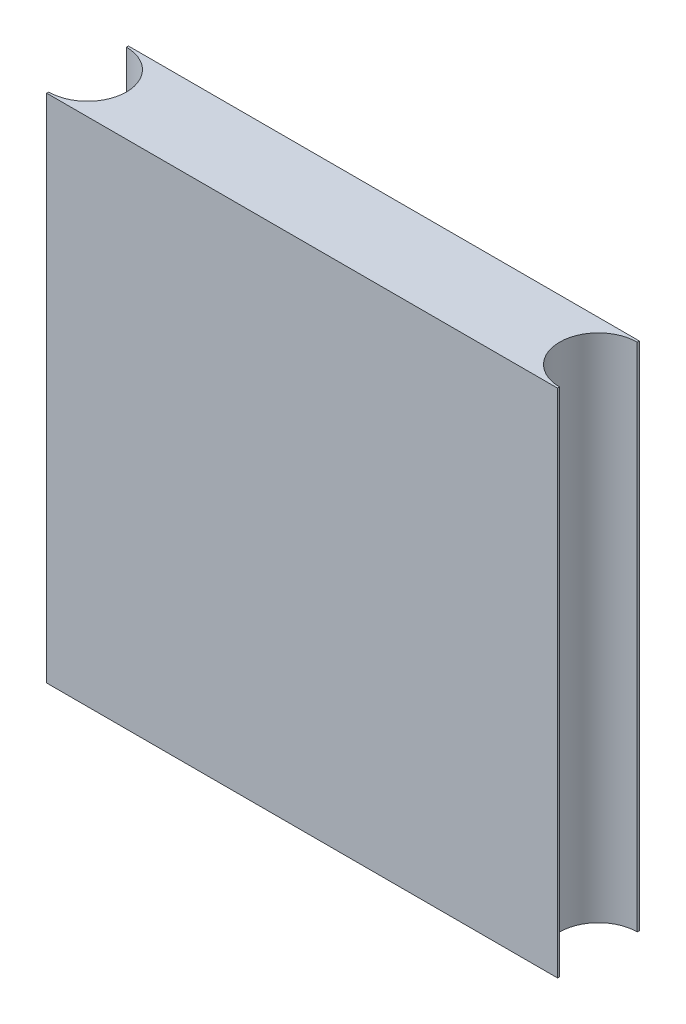
ISO-10303-21;
HEADER;
FILE_DESCRIPTION(('STEP AP214'),'2;1');
FILE_NAME('part.step','',(''),(''),'','','');
FILE_SCHEMA(('AUTOMOTIVE_DESIGN { 1 0 10303 214 1 1 1 1 }'));
ENDSEC;
DATA;
#1=APPLICATION_CONTEXT('core data for automotive mechanical design processes');
#2=APPLICATION_PROTOCOL_DEFINITION('international standard','automotive_design',2000,#1);
#3=PRODUCT_CONTEXT('',#1,'mechanical');
#4=PRODUCT('Part','Part','',(#3));
#5=PRODUCT_RELATED_PRODUCT_CATEGORY('part','',(#4));
#6=PRODUCT_DEFINITION_FORMATION('','',#4);
#7=PRODUCT_DEFINITION_CONTEXT('part definition',#1,'design');
#8=PRODUCT_DEFINITION('design','',#6,#7);
#9=PRODUCT_DEFINITION_SHAPE('','',#8);
#10=(LENGTH_UNIT() NAMED_UNIT(*) SI_UNIT(.MILLI.,.METRE.));
#11=(NAMED_UNIT(*) PLANE_ANGLE_UNIT() SI_UNIT($,.RADIAN.));
#12=(NAMED_UNIT(*) SI_UNIT($,.STERADIAN.) SOLID_ANGLE_UNIT());
#13=UNCERTAINTY_MEASURE_WITH_UNIT(LENGTH_MEASURE(1.E-05),#10,'distance_accuracy_value','');
#14=(GEOMETRIC_REPRESENTATION_CONTEXT(3) GLOBAL_UNCERTAINTY_ASSIGNED_CONTEXT((#13)) GLOBAL_UNIT_ASSIGNED_CONTEXT((#10,
#11,#12)) REPRESENTATION_CONTEXT('',''));
#15=CARTESIAN_POINT('',(0.,0.,0.));
#16=DIRECTION('',(0.,0.,1.));
#17=DIRECTION('',(1.,0.,0.));
#18=AXIS2_PLACEMENT_3D('',#15,#16,#17);
#19=CARTESIAN_POINT('',(0.,0.,8.));
#20=DIRECTION('',(1.,0.,0.));
#21=DIRECTION('',(0.,0.,-1.));
#22=AXIS2_PLACEMENT_3D('',#19,#20,#21);
#23=PLANE('',#22);
#24=DIRECTION('',(0.,0.,-1.));
#25=VECTOR('',#24,1.);
#26=CARTESIAN_POINT('',(0.,50.,8.));
#27=LINE('',#26,#25);
#28=CARTESIAN_POINT('',(0.,50.,8.));
#29=VERTEX_POINT('',#28);
#30=CARTESIAN_POINT('',(0.,50.,7.8));
#31=VERTEX_POINT('',#30);
#32=EDGE_CURVE('E164',#29,#31,#27,.T.);
#33=ORIENTED_EDGE('',*,*,#32,.T.);
#34=DIRECTION('',(0.,-1.,0.));
#35=VECTOR('',#34,1.);
#36=CARTESIAN_POINT('',(0.,68.,7.8));
#37=LINE('',#36,#35);
#38=CARTESIAN_POINT('',(0.,0.,7.8));
#39=VERTEX_POINT('',#38);
#40=EDGE_CURVE('E60',#31,#39,#37,.T.);
#41=ORIENTED_EDGE('',*,*,#40,.T.);
#42=DIRECTION('',(0.,0.,-1.));
#43=VECTOR('',#42,1.);
#44=CARTESIAN_POINT('',(0.,0.,8.));
#45=LINE('',#44,#43);
#46=CARTESIAN_POINT('',(0.,0.,8.));
#47=VERTEX_POINT('',#46);
#48=EDGE_CURVE('E131',#47,#39,#45,.T.);
#49=ORIENTED_EDGE('',*,*,#48,.F.);
#50=DIRECTION('',(0.,-1.,0.));
#51=VECTOR('',#50,1.);
#52=CARTESIAN_POINT('',(0.,0.,8.));
#53=LINE('',#52,#51);
#54=EDGE_CURVE('E148',#29,#47,#53,.T.);
#55=ORIENTED_EDGE('',*,*,#54,.F.);
#56=EDGE_LOOP('',(#33,#41,#49,#55));
#57=FACE_BOUND('',#56,.T.);
#58=ADVANCED_FACE('F37',(#57),#23,.F.);
#59=CARTESIAN_POINT('',(50.,0.,8.));
#60=DIRECTION('',(-1.,0.,0.));
#61=DIRECTION('',(0.,0.,1.));
#62=AXIS2_PLACEMENT_3D('',#59,#60,#61);
#63=PLANE('',#62);
#64=DIRECTION('',(0.,0.,-1.));
#65=VECTOR('',#64,1.);
#66=CARTESIAN_POINT('',(50.,50.,8.));
#67=LINE('',#66,#65);
#68=CARTESIAN_POINT('',(50.,50.,0.200000000000004));
#69=VERTEX_POINT('',#68);
#70=CARTESIAN_POINT('',(50.,50.,0.));
#71=VERTEX_POINT('',#70);
#72=EDGE_CURVE('E115',#69,#71,#67,.T.);
#73=ORIENTED_EDGE('',*,*,#72,.F.);
#74=DIRECTION('',(0.,-1.,0.));
#75=VECTOR('',#74,1.);
#76=CARTESIAN_POINT('',(50.,68.,0.200000000000004));
#77=LINE('',#76,#75);
#78=CARTESIAN_POINT('',(50.,0.,0.200000000000004));
#79=VERTEX_POINT('',#78);
#80=EDGE_CURVE('E52',#69,#79,#77,.T.);
#81=ORIENTED_EDGE('',*,*,#80,.T.);
#82=DIRECTION('',(0.,0.,-1.));
#83=VECTOR('',#82,1.);
#84=CARTESIAN_POINT('',(50.,0.,8.));
#85=LINE('',#84,#83);
#86=CARTESIAN_POINT('',(50.,0.,0.));
#87=VERTEX_POINT('',#86);
#88=EDGE_CURVE('E113',#79,#87,#85,.T.);
#89=ORIENTED_EDGE('',*,*,#88,.T.);
#90=DIRECTION('',(0.,1.,0.));
#91=VECTOR('',#90,1.);
#92=CARTESIAN_POINT('',(50.,0.,0.));
#93=LINE('',#92,#91);
#94=EDGE_CURVE('E162',#87,#71,#93,.T.);
#95=ORIENTED_EDGE('',*,*,#94,.T.);
#96=EDGE_LOOP('',(#73,#81,#89,#95));
#97=FACE_BOUND('',#96,.T.);
#98=ADVANCED_FACE('F111',(#97),#63,.F.);
#99=CARTESIAN_POINT('',(0.,0.,0.2));
#100=VERTEX_POINT('',#99);
#101=CARTESIAN_POINT('',(0.,0.,0.));
#102=VERTEX_POINT('',#101);
#103=EDGE_CURVE('E126',#100,#102,#45,.T.);
#104=ORIENTED_EDGE('',*,*,#103,.F.);
#105=DIRECTION('',(0.,-1.,0.));
#106=VECTOR('',#105,1.);
#107=CARTESIAN_POINT('',(0.,68.,0.2));
#108=LINE('',#107,#106);
#109=CARTESIAN_POINT('',(0.,50.,0.2));
#110=VERTEX_POINT('',#109);
#111=EDGE_CURVE('E116',#100,#110,#108,.F.);
#112=ORIENTED_EDGE('',*,*,#111,.T.);
#113=CARTESIAN_POINT('',(0.,50.,0.));
#114=VERTEX_POINT('',#113);
#115=EDGE_CURVE('E158',#110,#114,#27,.T.);
#116=ORIENTED_EDGE('',*,*,#115,.T.);
#117=DIRECTION('',(0.,-1.,0.));
#118=VECTOR('',#117,1.);
#119=CARTESIAN_POINT('',(0.,0.,0.));
#120=LINE('',#119,#118);
#121=EDGE_CURVE('E147',#114,#102,#120,.T.);
#122=ORIENTED_EDGE('',*,*,#121,.T.);
#123=EDGE_LOOP('',(#104,#112,#116,#122));
#124=FACE_BOUND('',#123,.T.);
#125=ADVANCED_FACE('F39',(#124),#23,.F.);
#126=CARTESIAN_POINT('',(0.,0.,8.));
#127=DIRECTION('',(0.,1.,0.));
#128=DIRECTION('',(0.,0.,1.));
#129=AXIS2_PLACEMENT_3D('',#126,#127,#128);
#130=PLANE('',#129);
#131=ORIENTED_EDGE('',*,*,#48,.T.);
#132=CARTESIAN_POINT('',(0.,0.,4.));
#133=DIRECTION('',(0.,-1.,0.));
#134=DIRECTION('',(0.,0.,-1.));
#135=AXIS2_PLACEMENT_3D('',#132,#133,#134);
#136=CIRCLE('',#135,3.8);
#137=EDGE_CURVE('E107',#100,#39,#136,.T.);
#138=ORIENTED_EDGE('',*,*,#137,.F.);
#139=ORIENTED_EDGE('',*,*,#103,.T.);
#140=DIRECTION('',(1.,0.,0.));
#141=VECTOR('',#140,1.);
#142=CARTESIAN_POINT('',(0.,0.,0.));
#143=LINE('',#142,#141);
#144=EDGE_CURVE('E121',#102,#87,#143,.T.);
#145=ORIENTED_EDGE('',*,*,#144,.T.);
#146=ORIENTED_EDGE('',*,*,#88,.F.);
#147=CARTESIAN_POINT('',(50.,0.,4.));
#148=DIRECTION('',(0.,-1.,0.));
#149=DIRECTION('',(0.,0.,-1.));
#150=AXIS2_PLACEMENT_3D('',#147,#148,#149);
#151=CIRCLE('',#150,3.8);
#152=CARTESIAN_POINT('',(50.,0.,7.8));
#153=VERTEX_POINT('',#152);
#154=EDGE_CURVE('E99',#153,#79,#151,.T.);
#155=ORIENTED_EDGE('',*,*,#154,.F.);
#156=CARTESIAN_POINT('',(50.,0.,8.));
#157=VERTEX_POINT('',#156);
#158=EDGE_CURVE('E123',#157,#153,#85,.T.);
#159=ORIENTED_EDGE('',*,*,#158,.F.);
#160=DIRECTION('',(1.,0.,0.));
#161=VECTOR('',#160,1.);
#162=CARTESIAN_POINT('',(0.,0.,8.));
#163=LINE('',#162,#161);
#164=EDGE_CURVE('E151',#47,#157,#163,.T.);
#165=ORIENTED_EDGE('',*,*,#164,.F.);
#166=EDGE_LOOP('',(#131,#138,#139,#145,#146,#155,#159,#165));
#167=FACE_BOUND('',#166,.T.);
#168=ADVANCED_FACE('F119',(#167),#130,.F.);
#169=ORIENTED_EDGE('',*,*,#158,.T.);
#170=DIRECTION('',(0.,-1.,0.));
#171=VECTOR('',#170,1.);
#172=CARTESIAN_POINT('',(50.,68.,7.8));
#173=LINE('',#172,#171);
#174=CARTESIAN_POINT('',(50.,50.,7.8));
#175=VERTEX_POINT('',#174);
#176=EDGE_CURVE('E102',#153,#175,#173,.F.);
#177=ORIENTED_EDGE('',*,*,#176,.T.);
#178=CARTESIAN_POINT('',(50.,50.,8.));
#179=VERTEX_POINT('',#178);
#180=EDGE_CURVE('E124',#179,#175,#67,.T.);
#181=ORIENTED_EDGE('',*,*,#180,.F.);
#182=DIRECTION('',(0.,1.,0.));
#183=VECTOR('',#182,1.);
#184=CARTESIAN_POINT('',(50.,0.,8.));
#185=LINE('',#184,#183);
#186=EDGE_CURVE('E154',#157,#179,#185,.T.);
#187=ORIENTED_EDGE('',*,*,#186,.F.);
#188=EDGE_LOOP('',(#169,#177,#181,#187));
#189=FACE_BOUND('',#188,.T.);
#190=ADVANCED_FACE('F139',(#189),#63,.F.);
#191=CARTESIAN_POINT('',(0.,50.,8.));
#192=DIRECTION('',(0.,-1.,0.));
#193=DIRECTION('',(0.,0.,-1.));
#194=AXIS2_PLACEMENT_3D('',#191,#192,#193);
#195=PLANE('',#194);
#196=ORIENTED_EDGE('',*,*,#115,.F.);
#197=CARTESIAN_POINT('',(0.,50.,4.));
#198=DIRECTION('',(0.,-1.,0.));
#199=DIRECTION('',(0.,0.,-1.));
#200=AXIS2_PLACEMENT_3D('',#197,#198,#199);
#201=CIRCLE('',#200,3.8);
#202=EDGE_CURVE('E11',#110,#31,#201,.T.);
#203=ORIENTED_EDGE('',*,*,#202,.T.);
#204=ORIENTED_EDGE('',*,*,#32,.F.);
#205=DIRECTION('',(-1.,0.,0.));
#206=VECTOR('',#205,1.);
#207=CARTESIAN_POINT('',(0.,50.,8.));
#208=LINE('',#207,#206);
#209=EDGE_CURVE('E156',#179,#29,#208,.T.);
#210=ORIENTED_EDGE('',*,*,#209,.F.);
#211=ORIENTED_EDGE('',*,*,#180,.T.);
#212=CARTESIAN_POINT('',(50.,50.,4.));
#213=DIRECTION('',(0.,-1.,0.));
#214=DIRECTION('',(0.,0.,-1.));
#215=AXIS2_PLACEMENT_3D('',#212,#213,#214);
#216=CIRCLE('',#215,3.8);
#217=EDGE_CURVE('E45',#175,#69,#216,.T.);
#218=ORIENTED_EDGE('',*,*,#217,.T.);
#219=ORIENTED_EDGE('',*,*,#72,.T.);
#220=DIRECTION('',(-1.,0.,0.));
#221=VECTOR('',#220,1.);
#222=CARTESIAN_POINT('',(0.,50.,0.));
#223=LINE('',#222,#221);
#224=EDGE_CURVE('E152',#71,#114,#223,.T.);
#225=ORIENTED_EDGE('',*,*,#224,.T.);
#226=EDGE_LOOP('',(#196,#203,#204,#210,#211,#218,#219,#225));
#227=FACE_BOUND('',#226,.T.);
#228=ADVANCED_FACE('F134',(#227),#195,.F.);
#229=CARTESIAN_POINT('',(0.,0.,8.));
#230=DIRECTION('',(0.,0.,-1.));
#231=DIRECTION('',(-1.,0.,0.));
#232=AXIS2_PLACEMENT_3D('',#229,#230,#231);
#233=PLANE('',#232);
#234=ORIENTED_EDGE('',*,*,#54,.T.);
#235=ORIENTED_EDGE('',*,*,#164,.T.);
#236=ORIENTED_EDGE('',*,*,#186,.T.);
#237=ORIENTED_EDGE('',*,*,#209,.T.);
#238=EDGE_LOOP('',(#234,#235,#236,#237));
#239=FACE_BOUND('',#238,.T.);
#240=ADVANCED_FACE('F176',(#239),#233,.F.);
#241=CARTESIAN_POINT('',(0.,0.,0.));
#242=DIRECTION('',(0.,0.,-1.));
#243=DIRECTION('',(-1.,0.,0.));
#244=AXIS2_PLACEMENT_3D('',#241,#242,#243);
#245=PLANE('',#244);
#246=ORIENTED_EDGE('',*,*,#121,.F.);
#247=ORIENTED_EDGE('',*,*,#224,.F.);
#248=ORIENTED_EDGE('',*,*,#94,.F.);
#249=ORIENTED_EDGE('',*,*,#144,.F.);
#250=EDGE_LOOP('',(#246,#247,#248,#249));
#251=FACE_BOUND('',#250,.T.);
#252=ADVANCED_FACE('F174',(#251),#245,.T.);
#253=CARTESIAN_POINT('',(50.,68.,4.));
#254=DIRECTION('',(0.,-1.,0.));
#255=DIRECTION('',(0.,0.,-1.));
#256=AXIS2_PLACEMENT_3D('',#253,#254,#255);
#257=CYLINDRICAL_SURFACE('',#256,3.8);
#258=ORIENTED_EDGE('',*,*,#217,.F.);
#259=ORIENTED_EDGE('',*,*,#176,.F.);
#260=ORIENTED_EDGE('',*,*,#154,.T.);
#261=ORIENTED_EDGE('',*,*,#80,.F.);
#262=EDGE_LOOP('',(#258,#259,#260,#261));
#263=FACE_BOUND('',#262,.T.);
#264=ADVANCED_FACE('F100',(#263),#257,.F.);
#265=CARTESIAN_POINT('',(0.,68.,4.));
#266=DIRECTION('',(0.,-1.,0.));
#267=DIRECTION('',(0.,0.,-1.));
#268=AXIS2_PLACEMENT_3D('',#265,#266,#267);
#269=CYLINDRICAL_SURFACE('',#268,3.8);
#270=ORIENTED_EDGE('',*,*,#202,.F.);
#271=ORIENTED_EDGE('',*,*,#111,.F.);
#272=ORIENTED_EDGE('',*,*,#137,.T.);
#273=ORIENTED_EDGE('',*,*,#40,.F.);
#274=EDGE_LOOP('',(#270,#271,#272,#273));
#275=FACE_BOUND('',#274,.T.);
#276=ADVANCED_FACE('F182',(#275),#269,.F.);
#277=CLOSED_SHELL('',(#58,#98,#125,#168,#190,#228,#240,#252,#264,#276));
#278=MANIFOLD_SOLID_BREP('B2',#277);
#279=ADVANCED_BREP_SHAPE_REPRESENTATION('',(#18,#278),#14);
#280=SHAPE_DEFINITION_REPRESENTATION(#9,#279);
ENDSEC;
END-ISO-10303-21;
